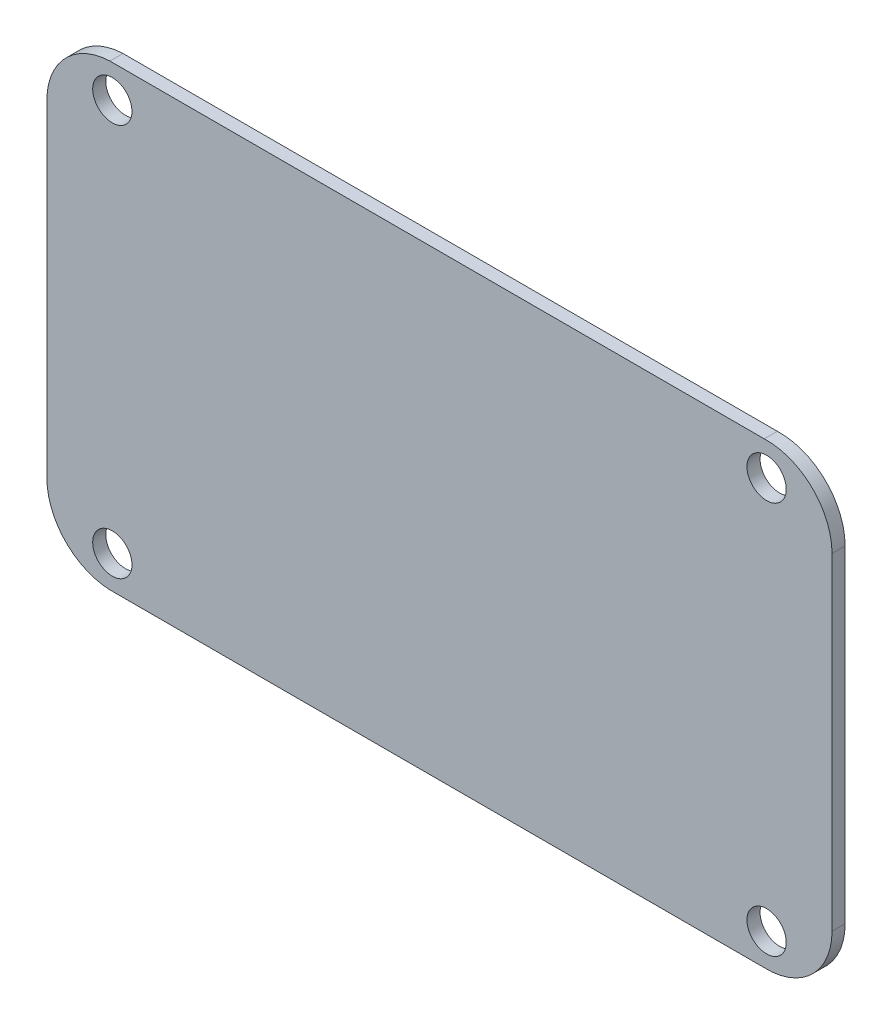
ISO-10303-21;
HEADER;
FILE_DESCRIPTION(('STEP AP214'),'2;1');
FILE_NAME('part.step','',(''),(''),'','','');
FILE_SCHEMA(('AUTOMOTIVE_DESIGN { 1 0 10303 214 1 1 1 1 }'));
ENDSEC;
DATA;
#1=APPLICATION_CONTEXT('core data for automotive mechanical design processes');
#2=APPLICATION_PROTOCOL_DEFINITION('international standard','automotive_design',2000,#1);
#3=PRODUCT_CONTEXT('',#1,'mechanical');
#4=PRODUCT('Part','Part','',(#3));
#5=PRODUCT_RELATED_PRODUCT_CATEGORY('part','',(#4));
#6=PRODUCT_DEFINITION_FORMATION('','',#4);
#7=PRODUCT_DEFINITION_CONTEXT('part definition',#1,'design');
#8=PRODUCT_DEFINITION('design','',#6,#7);
#9=PRODUCT_DEFINITION_SHAPE('','',#8);
#10=(LENGTH_UNIT() NAMED_UNIT(*) SI_UNIT(.MILLI.,.METRE.));
#11=(NAMED_UNIT(*) PLANE_ANGLE_UNIT() SI_UNIT($,.RADIAN.));
#12=(NAMED_UNIT(*) SI_UNIT($,.STERADIAN.) SOLID_ANGLE_UNIT());
#13=UNCERTAINTY_MEASURE_WITH_UNIT(LENGTH_MEASURE(1.E-05),#10,'distance_accuracy_value','');
#14=(GEOMETRIC_REPRESENTATION_CONTEXT(3) GLOBAL_UNCERTAINTY_ASSIGNED_CONTEXT((#13)) GLOBAL_UNIT_ASSIGNED_CONTEXT((#10,
#11,#12)) REPRESENTATION_CONTEXT('',''));
#15=CARTESIAN_POINT('',(0.,0.,0.));
#16=DIRECTION('',(0.,0.,1.));
#17=DIRECTION('',(1.,0.,0.));
#18=AXIS2_PLACEMENT_3D('',#15,#16,#17);
#19=CARTESIAN_POINT('',(-50.0000021680269,-25.006584871528,2.));
#20=DIRECTION('',(0.,0.,-1.));
#21=DIRECTION('',(-1.,0.,0.));
#22=AXIS2_PLACEMENT_3D('',#19,#20,#21);
#23=CYLINDRICAL_SURFACE('',#22,9.99999999999999);
#24=CARTESIAN_POINT('',(-50.0000021680269,-25.006584871528,0.));
#25=DIRECTION('',(0.,0.,1.));
#26=DIRECTION('',(1.,0.,0.));
#27=AXIS2_PLACEMENT_3D('',#24,#25,#26);
#28=CIRCLE('',#27,9.99999999999999);
#29=CARTESIAN_POINT('',(-60.,-24.9999999999999,0.));
#30=VERTEX_POINT('',#29);
#31=CARTESIAN_POINT('',(-50.3628438277444,-35.,0.));
#32=VERTEX_POINT('',#31);
#33=EDGE_CURVE('E132',#30,#32,#28,.T.);
#34=ORIENTED_EDGE('',*,*,#33,.T.);
#35=DIRECTION('',(0.,0.,-1.));
#36=VECTOR('',#35,1.);
#37=CARTESIAN_POINT('',(-50.3628438277444,-35.,2.));
#38=LINE('',#37,#36);
#39=CARTESIAN_POINT('',(-50.3628438277444,-35.,2.));
#40=VERTEX_POINT('',#39);
#41=EDGE_CURVE('E11',#40,#32,#38,.T.);
#42=ORIENTED_EDGE('',*,*,#41,.F.);
#43=CARTESIAN_POINT('',(-50.0000021680269,-25.006584871528,2.));
#44=DIRECTION('',(0.,0.,1.));
#45=DIRECTION('',(1.,0.,0.));
#46=AXIS2_PLACEMENT_3D('',#43,#44,#45);
#47=CIRCLE('',#46,9.99999999999999);
#48=CARTESIAN_POINT('',(-60.,-24.9999999999999,2.));
#49=VERTEX_POINT('',#48);
#50=EDGE_CURVE('E146',#49,#40,#47,.T.);
#51=ORIENTED_EDGE('',*,*,#50,.F.);
#52=DIRECTION('',(0.,0.,-1.));
#53=VECTOR('',#52,1.);
#54=CARTESIAN_POINT('',(-60.,-24.9999999999999,2.));
#55=LINE('',#54,#53);
#56=EDGE_CURVE('E128',#49,#30,#55,.T.);
#57=ORIENTED_EDGE('',*,*,#56,.T.);
#58=EDGE_LOOP('',(#34,#42,#51,#57));
#59=FACE_BOUND('',#58,.T.);
#60=ADVANCED_FACE('F34',(#59),#23,.T.);
#61=CARTESIAN_POINT('',(-50.3628438277444,-35.,2.));
#62=DIRECTION('',(0.,1.,0.));
#63=DIRECTION('',(-1.,0.,0.));
#64=AXIS2_PLACEMENT_3D('',#61,#62,#63);
#65=PLANE('',#64);
#66=DIRECTION('',(1.,0.,0.));
#67=VECTOR('',#66,1.);
#68=CARTESIAN_POINT('',(-50.3628438277444,-35.,0.));
#69=LINE('',#68,#67);
#70=CARTESIAN_POINT('',(49.6371561722554,-35.,0.));
#71=VERTEX_POINT('',#70);
#72=EDGE_CURVE('E135',#32,#71,#69,.T.);
#73=ORIENTED_EDGE('',*,*,#72,.T.);
#74=DIRECTION('',(0.,0.,-1.));
#75=VECTOR('',#74,1.);
#76=CARTESIAN_POINT('',(49.6371561722554,-35.,2.));
#77=LINE('',#76,#75);
#78=CARTESIAN_POINT('',(49.6371561722554,-35.,2.));
#79=VERTEX_POINT('',#78);
#80=EDGE_CURVE('E43',#79,#71,#77,.T.);
#81=ORIENTED_EDGE('',*,*,#80,.F.);
#82=DIRECTION('',(1.,0.,0.));
#83=VECTOR('',#82,1.);
#84=CARTESIAN_POINT('',(-50.3628438277444,-35.,2.));
#85=LINE('',#84,#83);
#86=EDGE_CURVE('E95',#40,#79,#85,.T.);
#87=ORIENTED_EDGE('',*,*,#86,.F.);
#88=ORIENTED_EDGE('',*,*,#41,.T.);
#89=EDGE_LOOP('',(#73,#81,#87,#88));
#90=FACE_BOUND('',#89,.T.);
#91=ADVANCED_FACE('F187',(#90),#65,.F.);
#92=CARTESIAN_POINT('',(50.0000021681306,-25.0065850289664,2.));
#93=DIRECTION('',(0.,0.,-1.));
#94=DIRECTION('',(-1.,0.,0.));
#95=AXIS2_PLACEMENT_3D('',#92,#93,#94);
#96=CYLINDRICAL_SURFACE('',#95,9.99999999999999);
#97=CARTESIAN_POINT('',(50.0000021681306,-25.0065850289664,0.));
#98=DIRECTION('',(0.,0.,1.));
#99=DIRECTION('',(1.,0.,0.));
#100=AXIS2_PLACEMENT_3D('',#97,#98,#99);
#101=CIRCLE('',#100,9.99999999999999);
#102=CARTESIAN_POINT('',(60.,-25.,0.));
#103=VERTEX_POINT('',#102);
#104=EDGE_CURVE('E137',#71,#103,#101,.T.);
#105=ORIENTED_EDGE('',*,*,#104,.T.);
#106=DIRECTION('',(0.,0.,-1.));
#107=VECTOR('',#106,1.);
#108=CARTESIAN_POINT('',(60.,-25.,2.));
#109=LINE('',#108,#107);
#110=CARTESIAN_POINT('',(60.,-25.,2.));
#111=VERTEX_POINT('',#110);
#112=EDGE_CURVE('E153',#111,#103,#109,.T.);
#113=ORIENTED_EDGE('',*,*,#112,.F.);
#114=CARTESIAN_POINT('',(50.0000021681306,-25.0065850289664,2.));
#115=DIRECTION('',(0.,0.,1.));
#116=DIRECTION('',(1.,0.,0.));
#117=AXIS2_PLACEMENT_3D('',#114,#115,#116);
#118=CIRCLE('',#117,9.99999999999999);
#119=EDGE_CURVE('E202',#79,#111,#118,.T.);
#120=ORIENTED_EDGE('',*,*,#119,.F.);
#121=ORIENTED_EDGE('',*,*,#80,.T.);
#122=EDGE_LOOP('',(#105,#113,#120,#121));
#123=FACE_BOUND('',#122,.T.);
#124=ADVANCED_FACE('F192',(#123),#96,.T.);
#125=CARTESIAN_POINT('',(60.,-25.,2.));
#126=DIRECTION('',(-1.,0.,0.));
#127=DIRECTION('',(0.,0.,1.));
#128=AXIS2_PLACEMENT_3D('',#125,#126,#127);
#129=PLANE('',#128);
#130=DIRECTION('',(0.,1.,0.));
#131=VECTOR('',#130,1.);
#132=CARTESIAN_POINT('',(60.,-25.,0.));
#133=LINE('',#132,#131);
#134=CARTESIAN_POINT('',(60.,25.,0.));
#135=VERTEX_POINT('',#134);
#136=EDGE_CURVE('E139',#103,#135,#133,.T.);
#137=ORIENTED_EDGE('',*,*,#136,.T.);
#138=DIRECTION('',(0.,0.,-1.));
#139=VECTOR('',#138,1.);
#140=CARTESIAN_POINT('',(60.,25.,2.));
#141=LINE('',#140,#139);
#142=CARTESIAN_POINT('',(60.,25.,2.));
#143=VERTEX_POINT('',#142);
#144=EDGE_CURVE('E150',#143,#135,#141,.T.);
#145=ORIENTED_EDGE('',*,*,#144,.F.);
#146=DIRECTION('',(0.,1.,0.));
#147=VECTOR('',#146,1.);
#148=CARTESIAN_POINT('',(60.,-25.,2.));
#149=LINE('',#148,#147);
#150=EDGE_CURVE('E204',#111,#143,#149,.T.);
#151=ORIENTED_EDGE('',*,*,#150,.F.);
#152=ORIENTED_EDGE('',*,*,#112,.T.);
#153=EDGE_LOOP('',(#137,#145,#151,#152));
#154=FACE_BOUND('',#153,.T.);
#155=ADVANCED_FACE('F249',(#154),#129,.F.);
#156=CARTESIAN_POINT('',(50.0000021681306,25.0065850289665,2.));
#157=DIRECTION('',(0.,0.,-1.));
#158=DIRECTION('',(-1.,0.,0.));
#159=AXIS2_PLACEMENT_3D('',#156,#157,#158);
#160=CYLINDRICAL_SURFACE('',#159,9.99999999999999);
#161=CARTESIAN_POINT('',(50.0000021681306,25.0065850289665,0.));
#162=DIRECTION('',(0.,0.,1.));
#163=DIRECTION('',(1.,0.,0.));
#164=AXIS2_PLACEMENT_3D('',#161,#162,#163);
#165=CIRCLE('',#164,9.99999999999999);
#166=CARTESIAN_POINT('',(49.6371561722554,35.,0.));
#167=VERTEX_POINT('',#166);
#168=EDGE_CURVE('E141',#135,#167,#165,.T.);
#169=ORIENTED_EDGE('',*,*,#168,.T.);
#170=DIRECTION('',(0.,0.,-1.));
#171=VECTOR('',#170,1.);
#172=CARTESIAN_POINT('',(49.6371561722554,35.,2.));
#173=LINE('',#172,#171);
#174=CARTESIAN_POINT('',(49.6371561722554,35.,2.));
#175=VERTEX_POINT('',#174);
#176=EDGE_CURVE('E123',#175,#167,#173,.T.);
#177=ORIENTED_EDGE('',*,*,#176,.F.);
#178=CARTESIAN_POINT('',(50.0000021681306,25.0065850289665,2.));
#179=DIRECTION('',(0.,0.,1.));
#180=DIRECTION('',(1.,0.,0.));
#181=AXIS2_PLACEMENT_3D('',#178,#179,#180);
#182=CIRCLE('',#181,9.99999999999999);
#183=EDGE_CURVE('E114',#143,#175,#182,.T.);
#184=ORIENTED_EDGE('',*,*,#183,.F.);
#185=ORIENTED_EDGE('',*,*,#144,.T.);
#186=EDGE_LOOP('',(#169,#177,#184,#185));
#187=FACE_BOUND('',#186,.T.);
#188=ADVANCED_FACE('F246',(#187),#160,.T.);
#189=CARTESIAN_POINT('',(49.6371561722554,35.,2.));
#190=DIRECTION('',(0.,-1.,0.));
#191=DIRECTION('',(0.,0.,-1.));
#192=AXIS2_PLACEMENT_3D('',#189,#190,#191);
#193=PLANE('',#192);
#194=DIRECTION('',(-1.,0.,0.));
#195=VECTOR('',#194,1.);
#196=CARTESIAN_POINT('',(49.6371561722554,35.,0.));
#197=LINE('',#196,#195);
#198=CARTESIAN_POINT('',(-50.3628438277444,35.,0.));
#199=VERTEX_POINT('',#198);
#200=EDGE_CURVE('E122',#167,#199,#197,.T.);
#201=ORIENTED_EDGE('',*,*,#200,.T.);
#202=DIRECTION('',(0.,0.,-1.));
#203=VECTOR('',#202,1.);
#204=CARTESIAN_POINT('',(-50.3628438277444,35.,2.));
#205=LINE('',#204,#203);
#206=CARTESIAN_POINT('',(-50.3628438277444,35.,2.));
#207=VERTEX_POINT('',#206);
#208=EDGE_CURVE('E119',#207,#199,#205,.T.);
#209=ORIENTED_EDGE('',*,*,#208,.F.);
#210=DIRECTION('',(-1.,0.,0.));
#211=VECTOR('',#210,1.);
#212=CARTESIAN_POINT('',(49.6371561722554,35.,2.));
#213=LINE('',#212,#211);
#214=EDGE_CURVE('E108',#175,#207,#213,.T.);
#215=ORIENTED_EDGE('',*,*,#214,.F.);
#216=ORIENTED_EDGE('',*,*,#176,.T.);
#217=EDGE_LOOP('',(#201,#209,#215,#216));
#218=FACE_BOUND('',#217,.T.);
#219=ADVANCED_FACE('F120',(#218),#193,.F.);
#220=CARTESIAN_POINT('',(-50.0000021680269,25.006584871528,2.));
#221=DIRECTION('',(0.,0.,-1.));
#222=DIRECTION('',(-1.,0.,0.));
#223=AXIS2_PLACEMENT_3D('',#220,#221,#222);
#224=CYLINDRICAL_SURFACE('',#223,9.99999999999999);
#225=CARTESIAN_POINT('',(-50.0000021680269,25.006584871528,0.));
#226=DIRECTION('',(0.,0.,1.));
#227=DIRECTION('',(1.,0.,0.));
#228=AXIS2_PLACEMENT_3D('',#225,#226,#227);
#229=CIRCLE('',#228,9.99999999999999);
#230=CARTESIAN_POINT('',(-60.,25.,0.));
#231=VERTEX_POINT('',#230);
#232=EDGE_CURVE('E81',#199,#231,#229,.T.);
#233=ORIENTED_EDGE('',*,*,#232,.T.);
#234=DIRECTION('',(0.,0.,-1.));
#235=VECTOR('',#234,1.);
#236=CARTESIAN_POINT('',(-60.,25.,2.));
#237=LINE('',#236,#235);
#238=CARTESIAN_POINT('',(-60.,25.,2.));
#239=VERTEX_POINT('',#238);
#240=EDGE_CURVE('E124',#239,#231,#237,.T.);
#241=ORIENTED_EDGE('',*,*,#240,.F.);
#242=CARTESIAN_POINT('',(-50.0000021680269,25.006584871528,2.));
#243=DIRECTION('',(0.,0.,1.));
#244=DIRECTION('',(1.,0.,0.));
#245=AXIS2_PLACEMENT_3D('',#242,#243,#244);
#246=CIRCLE('',#245,9.99999999999999);
#247=EDGE_CURVE('E112',#207,#239,#246,.T.);
#248=ORIENTED_EDGE('',*,*,#247,.F.);
#249=ORIENTED_EDGE('',*,*,#208,.T.);
#250=EDGE_LOOP('',(#233,#241,#248,#249));
#251=FACE_BOUND('',#250,.T.);
#252=ADVANCED_FACE('F126',(#251),#224,.T.);
#253=CARTESIAN_POINT('',(-60.,25.,2.));
#254=DIRECTION('',(1.,0.,0.));
#255=DIRECTION('',(0.,1.,0.));
#256=AXIS2_PLACEMENT_3D('',#253,#254,#255);
#257=PLANE('',#256);
#258=DIRECTION('',(0.,-1.,0.));
#259=VECTOR('',#258,1.);
#260=CARTESIAN_POINT('',(-60.,25.,0.));
#261=LINE('',#260,#259);
#262=EDGE_CURVE('E87',#231,#30,#261,.T.);
#263=ORIENTED_EDGE('',*,*,#262,.T.);
#264=ORIENTED_EDGE('',*,*,#56,.F.);
#265=DIRECTION('',(0.,-1.,0.));
#266=VECTOR('',#265,1.);
#267=CARTESIAN_POINT('',(-60.,25.,2.));
#268=LINE('',#267,#266);
#269=EDGE_CURVE('E52',#239,#49,#268,.T.);
#270=ORIENTED_EDGE('',*,*,#269,.F.);
#271=ORIENTED_EDGE('',*,*,#240,.T.);
#272=EDGE_LOOP('',(#263,#264,#270,#271));
#273=FACE_BOUND('',#272,.T.);
#274=ADVANCED_FACE('F225',(#273),#257,.F.);
#275=CARTESIAN_POINT('',(-50.0000021680269,-25.006584871528,2.));
#276=DIRECTION('',(0.,0.,1.));
#277=DIRECTION('',(1.,0.,0.));
#278=AXIS2_PLACEMENT_3D('',#275,#276,#277);
#279=PLANE('',#278);
#280=CARTESIAN_POINT('',(-50.,-30.,2.));
#281=DIRECTION('',(0.,0.,1.));
#282=DIRECTION('',(-1.,0.,0.));
#283=AXIS2_PLACEMENT_3D('',#280,#281,#282);
#284=CIRCLE('',#283,3.);
#285=CARTESIAN_POINT('',(-53.,-30.,2.));
#286=VERTEX_POINT('',#285);
#287=EDGE_CURVE('E213',#286,#286,#284,.T.);
#288=ORIENTED_EDGE('',*,*,#287,.F.);
#289=EDGE_LOOP('',(#288));
#290=FACE_BOUND('',#289,.T.);
#291=CARTESIAN_POINT('',(50.,-30.,2.));
#292=DIRECTION('',(0.,0.,1.));
#293=DIRECTION('',(1.,0.,0.));
#294=AXIS2_PLACEMENT_3D('',#291,#292,#293);
#295=CIRCLE('',#294,3.);
#296=CARTESIAN_POINT('',(53.,-30.,2.));
#297=VERTEX_POINT('',#296);
#298=EDGE_CURVE('E215',#297,#297,#295,.T.);
#299=ORIENTED_EDGE('',*,*,#298,.F.);
#300=EDGE_LOOP('',(#299));
#301=FACE_BOUND('',#300,.T.);
#302=CARTESIAN_POINT('',(50.,30.,2.));
#303=DIRECTION('',(0.,0.,1.));
#304=DIRECTION('',(-1.,0.,0.));
#305=AXIS2_PLACEMENT_3D('',#302,#303,#304);
#306=CIRCLE('',#305,3.);
#307=CARTESIAN_POINT('',(47.,30.,2.));
#308=VERTEX_POINT('',#307);
#309=EDGE_CURVE('E212',#308,#308,#306,.T.);
#310=ORIENTED_EDGE('',*,*,#309,.F.);
#311=EDGE_LOOP('',(#310));
#312=FACE_BOUND('',#311,.T.);
#313=CARTESIAN_POINT('',(-50.,30.,2.));
#314=DIRECTION('',(0.,0.,1.));
#315=DIRECTION('',(1.,0.,0.));
#316=AXIS2_PLACEMENT_3D('',#313,#314,#315);
#317=CIRCLE('',#316,3.);
#318=CARTESIAN_POINT('',(-47.,30.,2.));
#319=VERTEX_POINT('',#318);
#320=EDGE_CURVE('E162',#319,#319,#317,.T.);
#321=ORIENTED_EDGE('',*,*,#320,.F.);
#322=EDGE_LOOP('',(#321));
#323=FACE_BOUND('',#322,.T.);
#324=ORIENTED_EDGE('',*,*,#50,.T.);
#325=ORIENTED_EDGE('',*,*,#86,.T.);
#326=ORIENTED_EDGE('',*,*,#119,.T.);
#327=ORIENTED_EDGE('',*,*,#150,.T.);
#328=ORIENTED_EDGE('',*,*,#183,.T.);
#329=ORIENTED_EDGE('',*,*,#214,.T.);
#330=ORIENTED_EDGE('',*,*,#247,.T.);
#331=ORIENTED_EDGE('',*,*,#269,.T.);
#332=EDGE_LOOP('',(#324,#325,#326,#327,#328,#329,#330,#331));
#333=FACE_BOUND('',#332,.T.);
#334=ADVANCED_FACE('F110',(#290,#301,#312,#323,#333),#279,.T.);
#335=CARTESIAN_POINT('',(-50.0000021680269,-25.006584871528,0.));
#336=DIRECTION('',(0.,0.,1.));
#337=DIRECTION('',(1.,0.,0.));
#338=AXIS2_PLACEMENT_3D('',#335,#336,#337);
#339=PLANE('',#338);
#340=CARTESIAN_POINT('',(-50.,-30.,0.));
#341=DIRECTION('',(0.,0.,1.));
#342=DIRECTION('',(1.,0.,0.));
#343=AXIS2_PLACEMENT_3D('',#340,#341,#342);
#344=CIRCLE('',#343,3.);
#345=CARTESIAN_POINT('',(-47.,-30.,0.));
#346=VERTEX_POINT('',#345);
#347=EDGE_CURVE('E37',#346,#346,#344,.T.);
#348=ORIENTED_EDGE('',*,*,#347,.T.);
#349=EDGE_LOOP('',(#348));
#350=FACE_BOUND('',#349,.T.);
#351=CARTESIAN_POINT('',(50.,-30.,0.));
#352=DIRECTION('',(0.,0.,1.));
#353=DIRECTION('',(1.,0.,0.));
#354=AXIS2_PLACEMENT_3D('',#351,#352,#353);
#355=CIRCLE('',#354,3.);
#356=CARTESIAN_POINT('',(53.,-30.,0.));
#357=VERTEX_POINT('',#356);
#358=EDGE_CURVE('E164',#357,#357,#355,.T.);
#359=ORIENTED_EDGE('',*,*,#358,.T.);
#360=EDGE_LOOP('',(#359));
#361=FACE_BOUND('',#360,.T.);
#362=CARTESIAN_POINT('',(50.,30.,0.));
#363=DIRECTION('',(0.,0.,1.));
#364=DIRECTION('',(1.,0.,0.));
#365=AXIS2_PLACEMENT_3D('',#362,#363,#364);
#366=CIRCLE('',#365,3.);
#367=CARTESIAN_POINT('',(53.,30.,0.));
#368=VERTEX_POINT('',#367);
#369=EDGE_CURVE('E161',#368,#368,#366,.T.);
#370=ORIENTED_EDGE('',*,*,#369,.T.);
#371=EDGE_LOOP('',(#370));
#372=FACE_BOUND('',#371,.T.);
#373=CARTESIAN_POINT('',(-50.,30.,0.));
#374=DIRECTION('',(0.,0.,1.));
#375=DIRECTION('',(1.,0.,0.));
#376=AXIS2_PLACEMENT_3D('',#373,#374,#375);
#377=CIRCLE('',#376,3.);
#378=CARTESIAN_POINT('',(-47.,30.,0.));
#379=VERTEX_POINT('',#378);
#380=EDGE_CURVE('E158',#379,#379,#377,.T.);
#381=ORIENTED_EDGE('',*,*,#380,.T.);
#382=EDGE_LOOP('',(#381));
#383=FACE_BOUND('',#382,.T.);
#384=ORIENTED_EDGE('',*,*,#33,.F.);
#385=ORIENTED_EDGE('',*,*,#262,.F.);
#386=ORIENTED_EDGE('',*,*,#232,.F.);
#387=ORIENTED_EDGE('',*,*,#200,.F.);
#388=ORIENTED_EDGE('',*,*,#168,.F.);
#389=ORIENTED_EDGE('',*,*,#136,.F.);
#390=ORIENTED_EDGE('',*,*,#104,.F.);
#391=ORIENTED_EDGE('',*,*,#72,.F.);
#392=EDGE_LOOP('',(#384,#385,#386,#387,#388,#389,#390,#391));
#393=FACE_BOUND('',#392,.T.);
#394=ADVANCED_FACE('F171',(#350,#361,#372,#383,#393),#339,.F.);
#395=CARTESIAN_POINT('',(-50.,30.,-8.00000000000001));
#396=DIRECTION('',(0.,0.,1.));
#397=DIRECTION('',(1.,0.,0.));
#398=AXIS2_PLACEMENT_3D('',#395,#396,#397);
#399=CYLINDRICAL_SURFACE('',#398,3.);
#400=ORIENTED_EDGE('',*,*,#320,.T.);
#401=EDGE_LOOP('',(#400));
#402=FACE_BOUND('',#401,.T.);
#403=ORIENTED_EDGE('',*,*,#380,.F.);
#404=EDGE_LOOP('',(#403));
#405=FACE_BOUND('',#404,.T.);
#406=ADVANCED_FACE('F230',(#402,#405),#399,.F.);
#407=CARTESIAN_POINT('',(50.,30.,-8.00000000000001));
#408=DIRECTION('',(0.,0.,1.));
#409=DIRECTION('',(1.,0.,0.));
#410=AXIS2_PLACEMENT_3D('',#407,#408,#409);
#411=CYLINDRICAL_SURFACE('',#410,3.);
#412=ORIENTED_EDGE('',*,*,#309,.T.);
#413=EDGE_LOOP('',(#412));
#414=FACE_BOUND('',#413,.T.);
#415=ORIENTED_EDGE('',*,*,#369,.F.);
#416=EDGE_LOOP('',(#415));
#417=FACE_BOUND('',#416,.T.);
#418=ADVANCED_FACE('F181',(#414,#417),#411,.F.);
#419=CARTESIAN_POINT('',(50.,-30.,-8.00000000000001));
#420=DIRECTION('',(0.,0.,1.));
#421=DIRECTION('',(1.,0.,0.));
#422=AXIS2_PLACEMENT_3D('',#419,#420,#421);
#423=CYLINDRICAL_SURFACE('',#422,3.);
#424=ORIENTED_EDGE('',*,*,#298,.T.);
#425=EDGE_LOOP('',(#424));
#426=FACE_BOUND('',#425,.T.);
#427=ORIENTED_EDGE('',*,*,#358,.F.);
#428=EDGE_LOOP('',(#427));
#429=FACE_BOUND('',#428,.T.);
#430=ADVANCED_FACE('F175',(#426,#429),#423,.F.);
#431=CARTESIAN_POINT('',(-50.,-30.,-8.00000000000001));
#432=DIRECTION('',(0.,0.,1.));
#433=DIRECTION('',(1.,0.,0.));
#434=AXIS2_PLACEMENT_3D('',#431,#432,#433);
#435=CYLINDRICAL_SURFACE('',#434,3.);
#436=ORIENTED_EDGE('',*,*,#287,.T.);
#437=EDGE_LOOP('',(#436));
#438=FACE_BOUND('',#437,.T.);
#439=ORIENTED_EDGE('',*,*,#347,.F.);
#440=EDGE_LOOP('',(#439));
#441=FACE_BOUND('',#440,.T.);
#442=ADVANCED_FACE('F173',(#438,#441),#435,.F.);
#443=CLOSED_SHELL('',(#60,#91,#124,#155,#188,#219,#252,#274,#334,#394,#406,#418,#430,#442));
#444=MANIFOLD_SOLID_BREP('B2',#443);
#445=ADVANCED_BREP_SHAPE_REPRESENTATION('',(#18,#444),#14);
#446=SHAPE_DEFINITION_REPRESENTATION(#9,#445);
ENDSEC;
END-ISO-10303-21;
